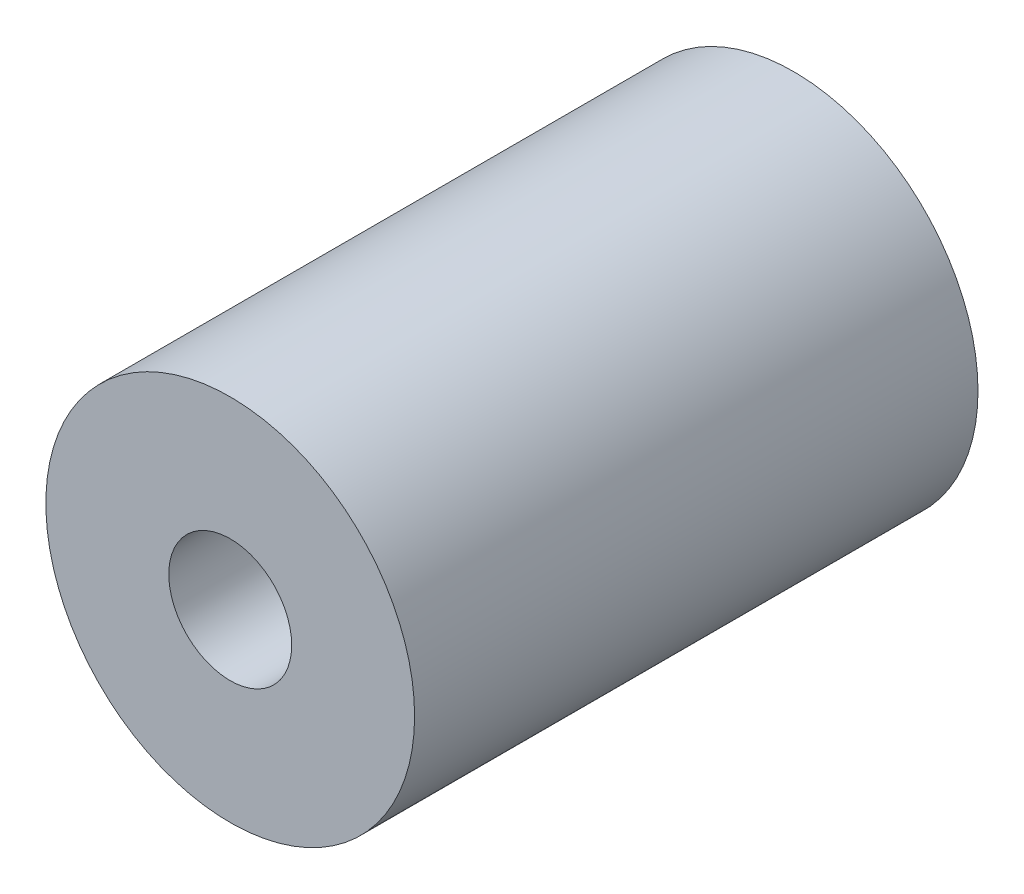
ISO-10303-21;
HEADER;
FILE_DESCRIPTION(('STEP AP214'),'2;1');
FILE_NAME('part.step','',(''),(''),'','','');
FILE_SCHEMA(('AUTOMOTIVE_DESIGN { 1 0 10303 214 1 1 1 1 }'));
ENDSEC;
DATA;
#1=APPLICATION_CONTEXT('core data for automotive mechanical design processes');
#2=APPLICATION_PROTOCOL_DEFINITION('international standard','automotive_design',2000,#1);
#3=PRODUCT_CONTEXT('',#1,'mechanical');
#4=PRODUCT('Part','Part','',(#3));
#5=PRODUCT_RELATED_PRODUCT_CATEGORY('part','',(#4));
#6=PRODUCT_DEFINITION_FORMATION('','',#4);
#7=PRODUCT_DEFINITION_CONTEXT('part definition',#1,'design');
#8=PRODUCT_DEFINITION('design','',#6,#7);
#9=PRODUCT_DEFINITION_SHAPE('','',#8);
#10=(LENGTH_UNIT() NAMED_UNIT(*) SI_UNIT(.MILLI.,.METRE.));
#11=(NAMED_UNIT(*) PLANE_ANGLE_UNIT() SI_UNIT($,.RADIAN.));
#12=(NAMED_UNIT(*) SI_UNIT($,.STERADIAN.) SOLID_ANGLE_UNIT());
#13=UNCERTAINTY_MEASURE_WITH_UNIT(LENGTH_MEASURE(1.E-05),#10,'distance_accuracy_value','');
#14=(GEOMETRIC_REPRESENTATION_CONTEXT(3) GLOBAL_UNCERTAINTY_ASSIGNED_CONTEXT((#13)) GLOBAL_UNIT_ASSIGNED_CONTEXT((#10,
#11,#12)) REPRESENTATION_CONTEXT('',''));
#15=CARTESIAN_POINT('',(0.,0.,0.));
#16=DIRECTION('',(0.,0.,1.));
#17=DIRECTION('',(1.,0.,0.));
#18=AXIS2_PLACEMENT_3D('',#15,#16,#17);
#19=CARTESIAN_POINT('',(0.,0.,27.5));
#20=DIRECTION('',(0.,0.,1.));
#21=DIRECTION('',(1.,0.,0.));
#22=AXIS2_PLACEMENT_3D('',#19,#20,#21);
#23=PLANE('',#22);
#24=CARTESIAN_POINT('',(0.,0.,27.5));
#25=DIRECTION('',(0.,0.,1.));
#26=DIRECTION('',(1.,0.,0.));
#27=AXIS2_PLACEMENT_3D('',#24,#25,#26);
#28=CIRCLE('',#27,9.);
#29=CARTESIAN_POINT('',(9.,0.,27.5));
#30=VERTEX_POINT('',#29);
#31=EDGE_CURVE('E10',#30,#30,#28,.T.);
#32=ORIENTED_EDGE('',*,*,#31,.T.);
#33=EDGE_LOOP('',(#32));
#34=FACE_BOUND('',#33,.T.);
#35=CARTESIAN_POINT('',(0.,0.,27.5));
#36=DIRECTION('',(0.,0.,1.));
#37=DIRECTION('',(1.,0.,0.));
#38=AXIS2_PLACEMENT_3D('',#35,#36,#37);
#39=CIRCLE('',#38,3.);
#40=CARTESIAN_POINT('',(3.,0.,27.5));
#41=VERTEX_POINT('',#40);
#42=EDGE_CURVE('E42',#41,#41,#39,.T.);
#43=ORIENTED_EDGE('',*,*,#42,.F.);
#44=EDGE_LOOP('',(#43));
#45=FACE_BOUND('',#44,.T.);
#46=ADVANCED_FACE('F31',(#34,#45),#23,.T.);
#47=CARTESIAN_POINT('',(0.,0.,0.));
#48=DIRECTION('',(0.,0.,1.));
#49=DIRECTION('',(1.,0.,0.));
#50=AXIS2_PLACEMENT_3D('',#47,#48,#49);
#51=PLANE('',#50);
#52=CARTESIAN_POINT('',(0.,0.,0.));
#53=DIRECTION('',(0.,0.,1.));
#54=DIRECTION('',(1.,0.,0.));
#55=AXIS2_PLACEMENT_3D('',#52,#53,#54);
#56=CIRCLE('',#55,9.);
#57=CARTESIAN_POINT('',(9.,0.,0.));
#58=VERTEX_POINT('',#57);
#59=EDGE_CURVE('E35',#58,#58,#56,.T.);
#60=ORIENTED_EDGE('',*,*,#59,.F.);
#61=EDGE_LOOP('',(#60));
#62=FACE_BOUND('',#61,.T.);
#63=CARTESIAN_POINT('',(0.,0.,0.));
#64=DIRECTION('',(0.,0.,1.));
#65=DIRECTION('',(1.,0.,0.));
#66=AXIS2_PLACEMENT_3D('',#63,#64,#65);
#67=CIRCLE('',#66,3.);
#68=CARTESIAN_POINT('',(3.,0.,0.));
#69=VERTEX_POINT('',#68);
#70=EDGE_CURVE('E44',#69,#69,#67,.T.);
#71=ORIENTED_EDGE('',*,*,#70,.T.);
#72=EDGE_LOOP('',(#71));
#73=FACE_BOUND('',#72,.T.);
#74=ADVANCED_FACE('F54',(#62,#73),#51,.F.);
#75=CARTESIAN_POINT('',(0.,0.,27.5));
#76=DIRECTION('',(0.,0.,-1.));
#77=DIRECTION('',(-1.,0.,0.));
#78=AXIS2_PLACEMENT_3D('',#75,#76,#77);
#79=CYLINDRICAL_SURFACE('',#78,9.);
#80=ORIENTED_EDGE('',*,*,#31,.F.);
#81=EDGE_LOOP('',(#80));
#82=FACE_BOUND('',#81,.T.);
#83=ORIENTED_EDGE('',*,*,#59,.T.);
#84=EDGE_LOOP('',(#83));
#85=FACE_BOUND('',#84,.T.);
#86=ADVANCED_FACE('F33',(#82,#85),#79,.T.);
#87=CARTESIAN_POINT('',(0.,0.,27.5));
#88=DIRECTION('',(0.,0.,-1.));
#89=DIRECTION('',(-1.,0.,0.));
#90=AXIS2_PLACEMENT_3D('',#87,#88,#89);
#91=CYLINDRICAL_SURFACE('',#90,3.);
#92=ORIENTED_EDGE('',*,*,#42,.T.);
#93=EDGE_LOOP('',(#92));
#94=FACE_BOUND('',#93,.T.);
#95=ORIENTED_EDGE('',*,*,#70,.F.);
#96=EDGE_LOOP('',(#95));
#97=FACE_BOUND('',#96,.T.);
#98=ADVANCED_FACE('F50',(#94,#97),#91,.F.);
#99=CLOSED_SHELL('',(#46,#74,#86,#98));
#100=MANIFOLD_SOLID_BREP('B2',#99);
#101=ADVANCED_BREP_SHAPE_REPRESENTATION('',(#18,#100),#14);
#102=SHAPE_DEFINITION_REPRESENTATION(#9,#101);
ENDSEC;
END-ISO-10303-21;
